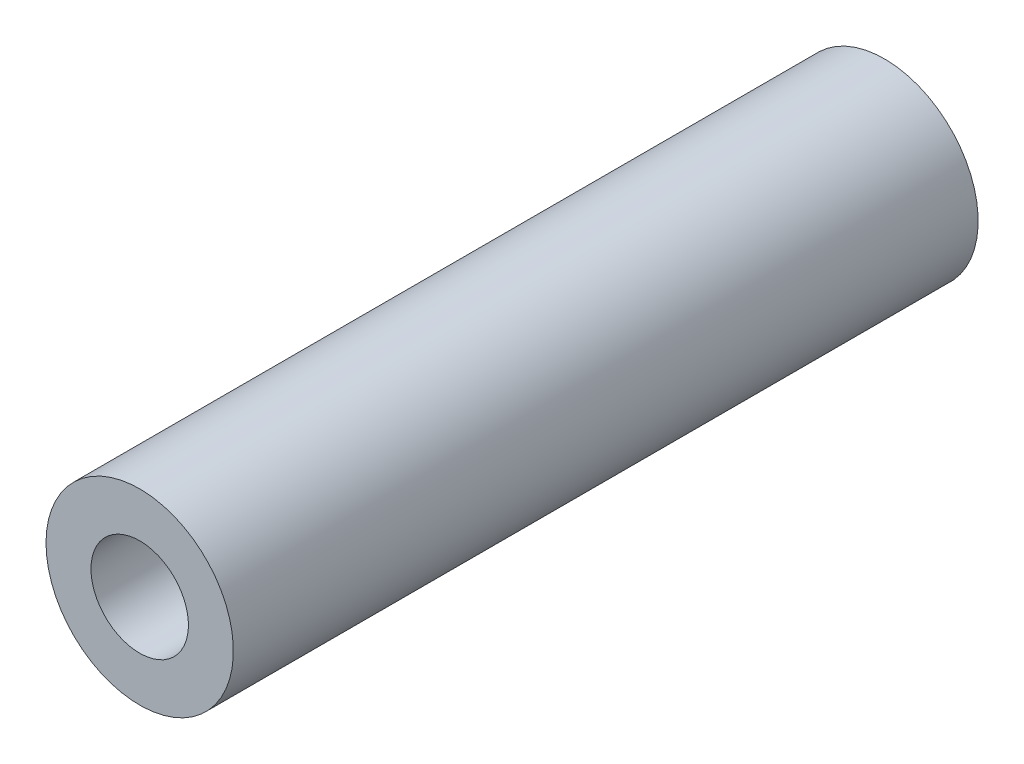
ISO-10303-21;
HEADER;
FILE_DESCRIPTION(('STEP AP214'),'2;1');
FILE_NAME('part.step','',(''),(''),'','','');
FILE_SCHEMA(('AUTOMOTIVE_DESIGN { 1 0 10303 214 1 1 1 1 }'));
ENDSEC;
DATA;
#1=APPLICATION_CONTEXT('core data for automotive mechanical design processes');
#2=APPLICATION_PROTOCOL_DEFINITION('international standard','automotive_design',2000,#1);
#3=PRODUCT_CONTEXT('',#1,'mechanical');
#4=PRODUCT('Part','Part','',(#3));
#5=PRODUCT_RELATED_PRODUCT_CATEGORY('part','',(#4));
#6=PRODUCT_DEFINITION_FORMATION('','',#4);
#7=PRODUCT_DEFINITION_CONTEXT('part definition',#1,'design');
#8=PRODUCT_DEFINITION('design','',#6,#7);
#9=PRODUCT_DEFINITION_SHAPE('','',#8);
#10=(LENGTH_UNIT() NAMED_UNIT(*) SI_UNIT(.MILLI.,.METRE.));
#11=(NAMED_UNIT(*) PLANE_ANGLE_UNIT() SI_UNIT($,.RADIAN.));
#12=(NAMED_UNIT(*) SI_UNIT($,.STERADIAN.) SOLID_ANGLE_UNIT());
#13=UNCERTAINTY_MEASURE_WITH_UNIT(LENGTH_MEASURE(1.E-05),#10,'distance_accuracy_value','');
#14=(GEOMETRIC_REPRESENTATION_CONTEXT(3) GLOBAL_UNCERTAINTY_ASSIGNED_CONTEXT((#13)) GLOBAL_UNIT_ASSIGNED_CONTEXT((#10,
#11,#12)) REPRESENTATION_CONTEXT('',''));
#15=CARTESIAN_POINT('',(0.,0.,0.));
#16=DIRECTION('',(0.,0.,1.));
#17=DIRECTION('',(1.,0.,0.));
#18=AXIS2_PLACEMENT_3D('',#15,#16,#17);
#19=CARTESIAN_POINT('',(0.,0.,39.75));
#20=DIRECTION('',(0.,0.,1.));
#21=DIRECTION('',(1.,0.,0.));
#22=AXIS2_PLACEMENT_3D('',#19,#20,#21);
#23=PLANE('',#22);
#24=CARTESIAN_POINT('',(0.,0.,39.75));
#25=DIRECTION('',(0.,0.,1.));
#26=DIRECTION('',(1.,0.,0.));
#27=AXIS2_PLACEMENT_3D('',#24,#25,#26);
#28=CIRCLE('',#27,5.);
#29=CARTESIAN_POINT('',(-5.,0.,39.75));
#30=VERTEX_POINT('',#29);
#31=EDGE_CURVE('E10',#30,#30,#28,.T.);
#32=ORIENTED_EDGE('',*,*,#31,.T.);
#33=EDGE_LOOP('',(#32));
#34=FACE_BOUND('',#33,.T.);
#35=CARTESIAN_POINT('',(0.,0.,39.75));
#36=DIRECTION('',(0.,0.,1.));
#37=DIRECTION('',(1.,0.,0.));
#38=AXIS2_PLACEMENT_3D('',#35,#36,#37);
#39=CIRCLE('',#38,2.6);
#40=CARTESIAN_POINT('',(-2.6,0.,39.75));
#41=VERTEX_POINT('',#40);
#42=EDGE_CURVE('E46',#41,#41,#39,.T.);
#43=ORIENTED_EDGE('',*,*,#42,.F.);
#44=EDGE_LOOP('',(#43));
#45=FACE_BOUND('',#44,.T.);
#46=ADVANCED_FACE('F35',(#34,#45),#23,.T.);
#47=CARTESIAN_POINT('',(0.,0.,0.));
#48=DIRECTION('',(0.,0.,1.));
#49=DIRECTION('',(1.,0.,0.));
#50=AXIS2_PLACEMENT_3D('',#47,#48,#49);
#51=PLANE('',#50);
#52=CARTESIAN_POINT('',(0.,0.,0.));
#53=DIRECTION('',(0.,0.,1.));
#54=DIRECTION('',(1.,0.,0.));
#55=AXIS2_PLACEMENT_3D('',#52,#53,#54);
#56=CIRCLE('',#55,5.);
#57=CARTESIAN_POINT('',(-5.,0.,0.));
#58=VERTEX_POINT('',#57);
#59=EDGE_CURVE('E39',#58,#58,#56,.T.);
#60=ORIENTED_EDGE('',*,*,#59,.F.);
#61=EDGE_LOOP('',(#60));
#62=FACE_BOUND('',#61,.T.);
#63=CARTESIAN_POINT('',(0.,0.,0.));
#64=DIRECTION('',(0.,0.,1.));
#65=DIRECTION('',(1.,0.,0.));
#66=AXIS2_PLACEMENT_3D('',#63,#64,#65);
#67=CIRCLE('',#66,2.6);
#68=CARTESIAN_POINT('',(-2.6,0.,0.));
#69=VERTEX_POINT('',#68);
#70=EDGE_CURVE('E48',#69,#69,#67,.T.);
#71=ORIENTED_EDGE('',*,*,#70,.T.);
#72=EDGE_LOOP('',(#71));
#73=FACE_BOUND('',#72,.T.);
#74=ADVANCED_FACE('F58',(#62,#73),#51,.F.);
#75=CARTESIAN_POINT('',(0.,0.,39.75));
#76=DIRECTION('',(0.,0.,-1.));
#77=DIRECTION('',(-1.,0.,0.));
#78=AXIS2_PLACEMENT_3D('',#75,#76,#77);
#79=CYLINDRICAL_SURFACE('',#78,5.);
#80=CARTESIAN_POINT('',(-5.,0.,39.75));
#81=CARTESIAN_POINT('',(-5.,0.,39.3359375));
#82=CARTESIAN_POINT('',(-5.,0.,38.921875));
#83=CARTESIAN_POINT('',(-5.,0.,38.09375));
#84=CARTESIAN_POINT('',(-5.,0.,37.6796875));
#85=CARTESIAN_POINT('',(-5.,0.,36.8515625));
#86=CARTESIAN_POINT('',(-5.,0.,36.4375));
#87=CARTESIAN_POINT('',(-5.,0.,35.609375));
#88=CARTESIAN_POINT('',(-5.,0.,35.1953125));
#89=CARTESIAN_POINT('',(-5.,0.,34.3671875));
#90=CARTESIAN_POINT('',(-5.,0.,33.953125));
#91=CARTESIAN_POINT('',(-5.,0.,33.125));
#92=CARTESIAN_POINT('',(-5.,0.,32.7109375));
#93=CARTESIAN_POINT('',(-5.,0.,31.8828125));
#94=CARTESIAN_POINT('',(-5.,0.,31.46875));
#95=CARTESIAN_POINT('',(-5.,0.,30.640625));
#96=CARTESIAN_POINT('',(-5.,0.,30.2265625));
#97=CARTESIAN_POINT('',(-5.,0.,29.3984375));
#98=CARTESIAN_POINT('',(-5.,0.,28.984375));
#99=CARTESIAN_POINT('',(-5.,0.,28.15625));
#100=CARTESIAN_POINT('',(-5.,0.,27.7421875));
#101=CARTESIAN_POINT('',(-5.,0.,26.9140625));
#102=CARTESIAN_POINT('',(-5.,0.,26.5));
#103=CARTESIAN_POINT('',(-5.,0.,25.671875));
#104=CARTESIAN_POINT('',(-5.,0.,25.2578125));
#105=CARTESIAN_POINT('',(-5.,0.,24.4296875));
#106=CARTESIAN_POINT('',(-5.,0.,24.015625));
#107=CARTESIAN_POINT('',(-5.,0.,23.1875));
#108=CARTESIAN_POINT('',(-5.,0.,22.7734375));
#109=CARTESIAN_POINT('',(-5.,0.,21.9453125));
#110=CARTESIAN_POINT('',(-5.,0.,21.53125));
#111=CARTESIAN_POINT('',(-5.,0.,20.703125));
#112=CARTESIAN_POINT('',(-5.,0.,20.2890625));
#113=CARTESIAN_POINT('',(-5.,0.,19.4609375));
#114=CARTESIAN_POINT('',(-5.,0.,19.046875));
#115=CARTESIAN_POINT('',(-5.,0.,18.21875));
#116=CARTESIAN_POINT('',(-5.,0.,17.8046875));
#117=CARTESIAN_POINT('',(-5.,0.,16.9765625));
#118=CARTESIAN_POINT('',(-5.,0.,16.5625));
#119=CARTESIAN_POINT('',(-5.,0.,15.734375));
#120=CARTESIAN_POINT('',(-5.,0.,15.3203125));
#121=CARTESIAN_POINT('',(-5.,0.,14.4921875));
#122=CARTESIAN_POINT('',(-5.,0.,14.078125));
#123=CARTESIAN_POINT('',(-5.,0.,13.25));
#124=CARTESIAN_POINT('',(-5.,0.,12.8359375));
#125=CARTESIAN_POINT('',(-5.,0.,12.0078125));
#126=CARTESIAN_POINT('',(-5.,0.,11.59375));
#127=CARTESIAN_POINT('',(-5.,0.,10.765625));
#128=CARTESIAN_POINT('',(-5.,0.,10.3515625));
#129=CARTESIAN_POINT('',(-5.,0.,9.5234375));
#130=CARTESIAN_POINT('',(-5.,0.,9.109375));
#131=CARTESIAN_POINT('',(-5.,0.,8.28125));
#132=CARTESIAN_POINT('',(-5.,0.,7.8671875));
#133=CARTESIAN_POINT('',(-5.,0.,7.0390625));
#134=CARTESIAN_POINT('',(-5.,0.,6.625));
#135=CARTESIAN_POINT('',(-5.,0.,5.796875));
#136=CARTESIAN_POINT('',(-5.,0.,5.3828125));
#137=CARTESIAN_POINT('',(-5.,0.,4.5546875));
#138=CARTESIAN_POINT('',(-5.,0.,4.140625));
#139=CARTESIAN_POINT('',(-5.,0.,3.3125));
#140=CARTESIAN_POINT('',(-5.,0.,2.8984375));
#141=CARTESIAN_POINT('',(-5.,0.,2.0703125));
#142=CARTESIAN_POINT('',(-5.,0.,1.65625));
#143=CARTESIAN_POINT('',(-5.,0.,0.828124999999999));
#144=CARTESIAN_POINT('',(-5.,0.,0.414062499999999));
#145=CARTESIAN_POINT('',(-5.,0.,0.));
#146=B_SPLINE_CURVE_WITH_KNOTS('',3,(#80,#81,#82,#83,#84,#85,#86,#87,#88,#89,#90,#91,#92,#93,
#94,#95,#96,#97,#98,#99,#100,#101,#102,#103,#104,#105,#106,#107,#108,#109,#110,#111,#112,#113,
#114,#115,#116,#117,#118,#119,#120,#121,#122,#123,#124,#125,#126,#127,#128,#129,#130,#131,#132,
#133,#134,#135,#136,#137,#138,#139,#140,#141,#142,#143,#144,#145),.UNSPECIFIED.,.F.,.F.,(4,2,2,
2,2,2,2,2,2,2,2,2,2,2,2,2,2,2,2,2,2,2,2,2,2,2,2,2,2,2,2,2,4),(0.,1.2421875,2.484375,3.7265625,
4.96874999999999,6.2109375,7.453125,8.6953125,9.93749999999999,11.1796875,12.421875,13.6640625,
14.90625,16.1484375,17.390625,18.6328125,19.875,21.1171875,22.359375,23.6015625,24.84375,
26.0859375,27.328125,28.5703125,29.8125,31.0546875,32.296875,33.5390625,34.78125,36.0234375,
37.265625,38.5078125,39.75),.UNSPECIFIED.);
#147=EDGE_CURVE('BSEAM37',#30,#58,#146,.T.);
#148=ORIENTED_EDGE('',*,*,#31,.F.);
#149=ORIENTED_EDGE('',*,*,#59,.T.);
#150=ORIENTED_EDGE('',*,*,#147,.T.);
#151=ORIENTED_EDGE('',*,*,#147,.F.);
#152=EDGE_LOOP('',(#148,#150,#149,#151));
#153=FACE_BOUND('',#152,.T.);
#154=ADVANCED_FACE('F37',(#153),#79,.T.);
#155=CARTESIAN_POINT('',(0.,0.,39.75));
#156=DIRECTION('',(0.,0.,-1.));
#157=DIRECTION('',(-1.,0.,0.));
#158=AXIS2_PLACEMENT_3D('',#155,#156,#157);
#159=CYLINDRICAL_SURFACE('',#158,2.6);
#160=CARTESIAN_POINT('',(-2.6,0.,39.75));
#161=CARTESIAN_POINT('',(-2.6,0.,39.3359375));
#162=CARTESIAN_POINT('',(-2.6,0.,38.921875));
#163=CARTESIAN_POINT('',(-2.6,0.,38.09375));
#164=CARTESIAN_POINT('',(-2.6,0.,37.6796875));
#165=CARTESIAN_POINT('',(-2.6,0.,36.8515625));
#166=CARTESIAN_POINT('',(-2.6,0.,36.4375));
#167=CARTESIAN_POINT('',(-2.6,0.,35.609375));
#168=CARTESIAN_POINT('',(-2.6,0.,35.1953125));
#169=CARTESIAN_POINT('',(-2.6,0.,34.3671875));
#170=CARTESIAN_POINT('',(-2.6,0.,33.953125));
#171=CARTESIAN_POINT('',(-2.6,0.,33.125));
#172=CARTESIAN_POINT('',(-2.6,0.,32.7109375));
#173=CARTESIAN_POINT('',(-2.6,0.,31.8828125));
#174=CARTESIAN_POINT('',(-2.6,0.,31.46875));
#175=CARTESIAN_POINT('',(-2.6,0.,30.640625));
#176=CARTESIAN_POINT('',(-2.6,0.,30.2265625));
#177=CARTESIAN_POINT('',(-2.6,0.,29.3984375));
#178=CARTESIAN_POINT('',(-2.6,0.,28.984375));
#179=CARTESIAN_POINT('',(-2.6,0.,28.15625));
#180=CARTESIAN_POINT('',(-2.6,0.,27.7421875));
#181=CARTESIAN_POINT('',(-2.6,0.,26.9140625));
#182=CARTESIAN_POINT('',(-2.6,0.,26.5));
#183=CARTESIAN_POINT('',(-2.6,0.,25.671875));
#184=CARTESIAN_POINT('',(-2.6,0.,25.2578125));
#185=CARTESIAN_POINT('',(-2.6,0.,24.4296875));
#186=CARTESIAN_POINT('',(-2.6,0.,24.015625));
#187=CARTESIAN_POINT('',(-2.6,0.,23.1875));
#188=CARTESIAN_POINT('',(-2.6,0.,22.7734375));
#189=CARTESIAN_POINT('',(-2.6,0.,21.9453125));
#190=CARTESIAN_POINT('',(-2.6,0.,21.53125));
#191=CARTESIAN_POINT('',(-2.6,0.,20.703125));
#192=CARTESIAN_POINT('',(-2.6,0.,20.2890625));
#193=CARTESIAN_POINT('',(-2.6,0.,19.4609375));
#194=CARTESIAN_POINT('',(-2.6,0.,19.046875));
#195=CARTESIAN_POINT('',(-2.6,0.,18.21875));
#196=CARTESIAN_POINT('',(-2.6,0.,17.8046875));
#197=CARTESIAN_POINT('',(-2.6,0.,16.9765625));
#198=CARTESIAN_POINT('',(-2.6,0.,16.5625));
#199=CARTESIAN_POINT('',(-2.6,0.,15.734375));
#200=CARTESIAN_POINT('',(-2.6,0.,15.3203125));
#201=CARTESIAN_POINT('',(-2.6,0.,14.4921875));
#202=CARTESIAN_POINT('',(-2.6,0.,14.078125));
#203=CARTESIAN_POINT('',(-2.6,0.,13.25));
#204=CARTESIAN_POINT('',(-2.6,0.,12.8359375));
#205=CARTESIAN_POINT('',(-2.6,0.,12.0078125));
#206=CARTESIAN_POINT('',(-2.6,0.,11.59375));
#207=CARTESIAN_POINT('',(-2.6,0.,10.765625));
#208=CARTESIAN_POINT('',(-2.6,0.,10.3515625));
#209=CARTESIAN_POINT('',(-2.6,0.,9.52343749999999));
#210=CARTESIAN_POINT('',(-2.6,0.,9.109375));
#211=CARTESIAN_POINT('',(-2.6,0.,8.28125));
#212=CARTESIAN_POINT('',(-2.6,0.,7.8671875));
#213=CARTESIAN_POINT('',(-2.6,0.,7.0390625));
#214=CARTESIAN_POINT('',(-2.6,0.,6.625));
#215=CARTESIAN_POINT('',(-2.6,0.,5.796875));
#216=CARTESIAN_POINT('',(-2.6,0.,5.3828125));
#217=CARTESIAN_POINT('',(-2.6,0.,4.5546875));
#218=CARTESIAN_POINT('',(-2.6,0.,4.140625));
#219=CARTESIAN_POINT('',(-2.6,0.,3.3125));
#220=CARTESIAN_POINT('',(-2.6,0.,2.8984375));
#221=CARTESIAN_POINT('',(-2.6,0.,2.0703125));
#222=CARTESIAN_POINT('',(-2.6,0.,1.65625));
#223=CARTESIAN_POINT('',(-2.6,0.,0.828124999999999));
#224=CARTESIAN_POINT('',(-2.6,0.,0.414062499999999));
#225=CARTESIAN_POINT('',(-2.6,0.,0.));
#226=B_SPLINE_CURVE_WITH_KNOTS('',3,(#160,#161,#162,#163,#164,#165,#166,#167,#168,#169,#170,
#171,#172,#173,#174,#175,#176,#177,#178,#179,#180,#181,#182,#183,#184,#185,#186,#187,#188,#189,
#190,#191,#192,#193,#194,#195,#196,#197,#198,#199,#200,#201,#202,#203,#204,#205,#206,#207,#208,
#209,#210,#211,#212,#213,#214,#215,#216,#217,#218,#219,#220,#221,#222,#223,#224,#225),
.UNSPECIFIED.,.F.,.F.,(4,2,2,2,2,2,2,2,2,2,2,2,2,2,2,2,2,2,2,2,2,2,2,2,2,2,2,2,2,2,2,2,4),(0.,
1.24218750000001,2.484375,3.7265625,4.96875,6.21093750000001,7.45312500000001,8.6953125,9.9375,
11.1796875,12.421875,13.6640625,14.90625,16.1484375,17.390625,18.6328125,19.875,21.1171875,
22.359375,23.6015625,24.84375,26.0859375,27.328125,28.5703125,29.8125,31.0546875,32.296875,
33.5390625,34.78125,36.0234375,37.265625,38.5078125,39.75),.UNSPECIFIED.);
#227=EDGE_CURVE('BSEAM54',#41,#69,#226,.T.);
#228=ORIENTED_EDGE('',*,*,#42,.T.);
#229=ORIENTED_EDGE('',*,*,#70,.F.);
#230=ORIENTED_EDGE('',*,*,#227,.T.);
#231=ORIENTED_EDGE('',*,*,#227,.F.);
#232=EDGE_LOOP('',(#228,#230,#229,#231));
#233=FACE_BOUND('',#232,.T.);
#234=ADVANCED_FACE('F54',(#233),#159,.F.);
#235=CLOSED_SHELL('',(#46,#74,#154,#234));
#236=MANIFOLD_SOLID_BREP('B2',#235);
#237=ADVANCED_BREP_SHAPE_REPRESENTATION('',(#18,#236),#14);
#238=SHAPE_DEFINITION_REPRESENTATION(#9,#237);
ENDSEC;
END-ISO-10303-21;
